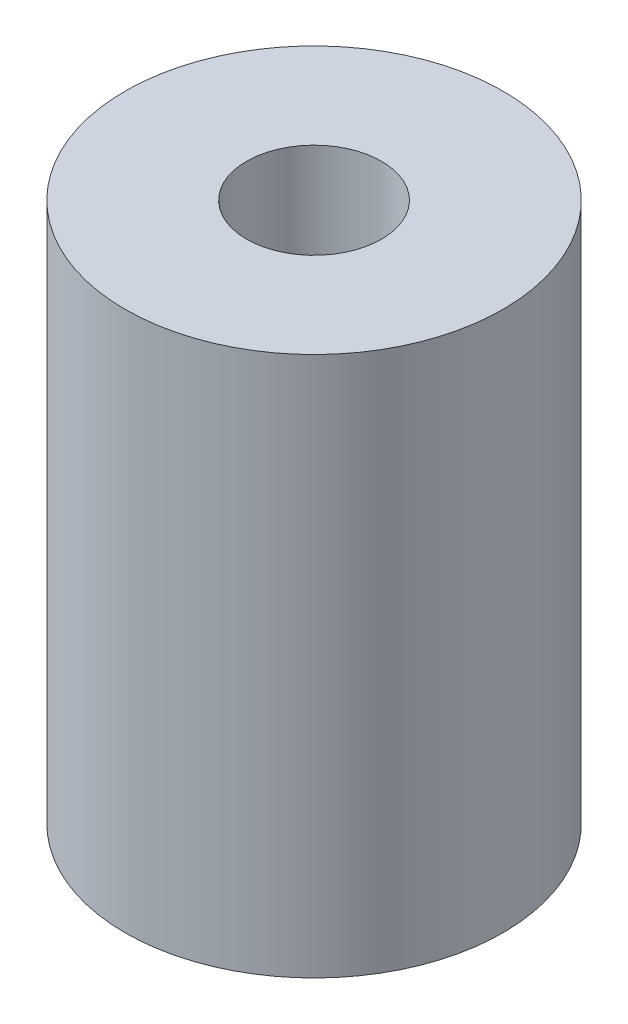
ISO-10303-21;
HEADER;
FILE_DESCRIPTION(('STEP AP214'),'2;1');
FILE_NAME('part.step','',(''),(''),'','','');
FILE_SCHEMA(('AUTOMOTIVE_DESIGN { 1 0 10303 214 1 1 1 1 }'));
ENDSEC;
DATA;
#1=APPLICATION_CONTEXT('core data for automotive mechanical design processes');
#2=APPLICATION_PROTOCOL_DEFINITION('international standard','automotive_design',2000,#1);
#3=PRODUCT_CONTEXT('',#1,'mechanical');
#4=PRODUCT('Part','Part','',(#3));
#5=PRODUCT_RELATED_PRODUCT_CATEGORY('part','',(#4));
#6=PRODUCT_DEFINITION_FORMATION('','',#4);
#7=PRODUCT_DEFINITION_CONTEXT('part definition',#1,'design');
#8=PRODUCT_DEFINITION('design','',#6,#7);
#9=PRODUCT_DEFINITION_SHAPE('','',#8);
#10=(LENGTH_UNIT() NAMED_UNIT(*) SI_UNIT(.MILLI.,.METRE.));
#11=(NAMED_UNIT(*) PLANE_ANGLE_UNIT() SI_UNIT($,.RADIAN.));
#12=(NAMED_UNIT(*) SI_UNIT($,.STERADIAN.) SOLID_ANGLE_UNIT());
#13=UNCERTAINTY_MEASURE_WITH_UNIT(LENGTH_MEASURE(1.E-05),#10,'distance_accuracy_value','');
#14=(GEOMETRIC_REPRESENTATION_CONTEXT(3) GLOBAL_UNCERTAINTY_ASSIGNED_CONTEXT((#13)) GLOBAL_UNIT_ASSIGNED_CONTEXT((#10,
#11,#12)) REPRESENTATION_CONTEXT('',''));
#15=CARTESIAN_POINT('',(0.,0.,0.));
#16=DIRECTION('',(0.,0.,1.));
#17=DIRECTION('',(1.,0.,0.));
#18=AXIS2_PLACEMENT_3D('',#15,#16,#17);
#19=CARTESIAN_POINT('',(0.,5.,0.));
#20=DIRECTION('',(0.,1.,0.));
#21=DIRECTION('',(0.,0.,1.));
#22=AXIS2_PLACEMENT_3D('',#19,#20,#21);
#23=PLANE('',#22);
#24=CARTESIAN_POINT('',(0.,5.,0.));
#25=DIRECTION('',(0.,1.,0.));
#26=DIRECTION('',(0.,0.,1.));
#27=AXIS2_PLACEMENT_3D('',#24,#25,#26);
#28=CIRCLE('',#27,1.24999999999999);
#29=CARTESIAN_POINT('',(0.,5.,1.24999999999999));
#30=VERTEX_POINT('',#29);
#31=EDGE_CURVE('E49',#30,#30,#28,.T.);
#32=ORIENTED_EDGE('',*,*,#31,.F.);
#33=EDGE_LOOP('',(#32));
#34=FACE_BOUND('',#33,.T.);
#35=CARTESIAN_POINT('',(0.,5.,0.));
#36=DIRECTION('',(0.,1.,0.));
#37=DIRECTION('',(0.,0.,1.));
#38=AXIS2_PLACEMENT_3D('',#35,#36,#37);
#39=CIRCLE('',#38,3.5);
#40=CARTESIAN_POINT('',(0.,5.,3.5));
#41=VERTEX_POINT('',#40);
#42=EDGE_CURVE('E10',#41,#41,#39,.T.);
#43=ORIENTED_EDGE('',*,*,#42,.T.);
#44=EDGE_LOOP('',(#43));
#45=FACE_BOUND('',#44,.T.);
#46=ADVANCED_FACE('F34',(#34,#45),#23,.T.);
#47=CARTESIAN_POINT('',(0.,-5.,0.));
#48=DIRECTION('',(0.,1.,0.));
#49=DIRECTION('',(0.,0.,1.));
#50=AXIS2_PLACEMENT_3D('',#47,#48,#49);
#51=PLANE('',#50);
#52=CARTESIAN_POINT('',(0.,-5.,0.));
#53=DIRECTION('',(0.,1.,0.));
#54=DIRECTION('',(0.,0.,1.));
#55=AXIS2_PLACEMENT_3D('',#52,#53,#54);
#56=CIRCLE('',#55,1.25);
#57=CARTESIAN_POINT('',(0.,-5.,1.25));
#58=VERTEX_POINT('',#57);
#59=EDGE_CURVE('E45',#58,#58,#56,.T.);
#60=ORIENTED_EDGE('',*,*,#59,.T.);
#61=EDGE_LOOP('',(#60));
#62=FACE_BOUND('',#61,.T.);
#63=CARTESIAN_POINT('',(0.,-5.,0.));
#64=DIRECTION('',(0.,1.,0.));
#65=DIRECTION('',(0.,0.,1.));
#66=AXIS2_PLACEMENT_3D('',#63,#64,#65);
#67=CIRCLE('',#66,3.5);
#68=CARTESIAN_POINT('',(0.,-5.,3.5));
#69=VERTEX_POINT('',#68);
#70=EDGE_CURVE('E38',#69,#69,#67,.T.);
#71=ORIENTED_EDGE('',*,*,#70,.F.);
#72=EDGE_LOOP('',(#71));
#73=FACE_BOUND('',#72,.T.);
#74=ADVANCED_FACE('F56',(#62,#73),#51,.F.);
#75=CARTESIAN_POINT('',(0.,5.,0.));
#76=DIRECTION('',(0.,-1.,0.));
#77=DIRECTION('',(0.,0.,-1.));
#78=AXIS2_PLACEMENT_3D('',#75,#76,#77);
#79=CYLINDRICAL_SURFACE('',#78,3.5);
#80=ORIENTED_EDGE('',*,*,#42,.F.);
#81=EDGE_LOOP('',(#80));
#82=FACE_BOUND('',#81,.T.);
#83=ORIENTED_EDGE('',*,*,#70,.T.);
#84=EDGE_LOOP('',(#83));
#85=FACE_BOUND('',#84,.T.);
#86=ADVANCED_FACE('F36',(#82,#85),#79,.T.);
#87=CARTESIAN_POINT('',(0.,5.,0.));
#88=DIRECTION('',(0.,1.,0.));
#89=DIRECTION('',(0.,0.,1.));
#90=AXIS2_PLACEMENT_3D('',#87,#88,#89);
#91=CYLINDRICAL_SURFACE('',#90,1.24999999999999);
#92=ORIENTED_EDGE('',*,*,#59,.F.);
#93=EDGE_LOOP('',(#92));
#94=FACE_BOUND('',#93,.T.);
#95=ORIENTED_EDGE('',*,*,#31,.T.);
#96=EDGE_LOOP('',(#95));
#97=FACE_BOUND('',#96,.T.);
#98=ADVANCED_FACE('F53',(#94,#97),#91,.F.);
#99=CLOSED_SHELL('',(#46,#74,#86,#98));
#100=MANIFOLD_SOLID_BREP('B2',#99);
#101=ADVANCED_BREP_SHAPE_REPRESENTATION('',(#18,#100),#14);
#102=SHAPE_DEFINITION_REPRESENTATION(#9,#101);
ENDSEC;
END-ISO-10303-21;
